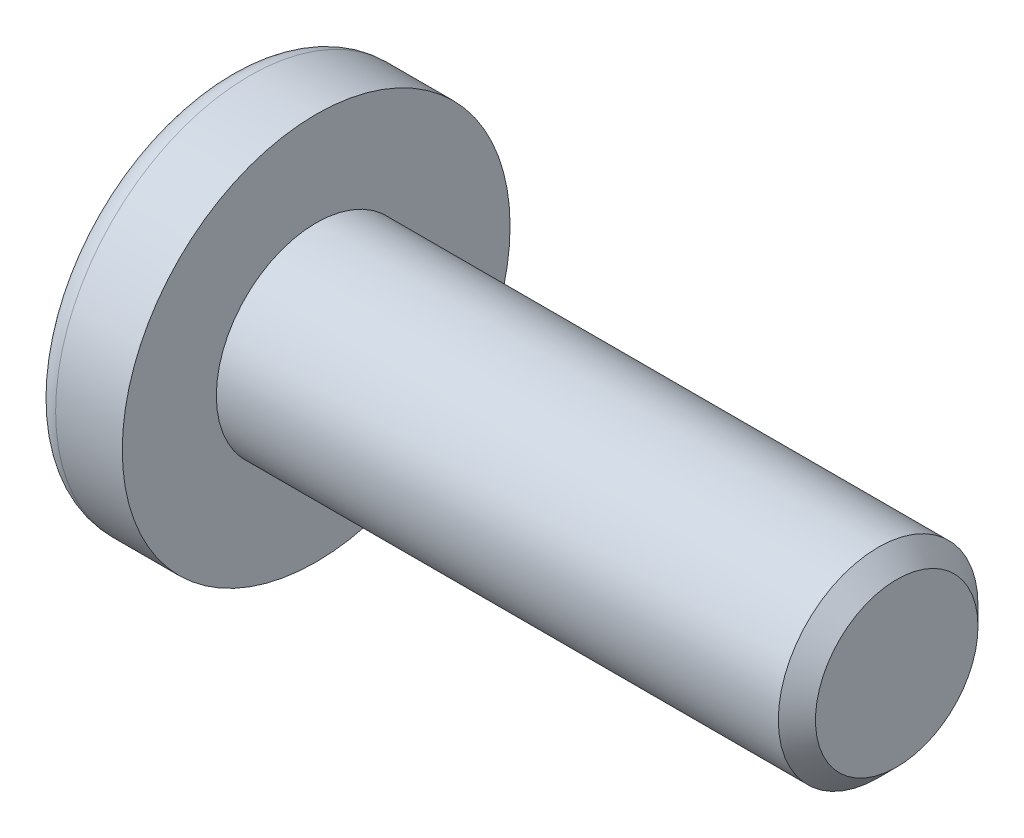
ISO-10303-21;
HEADER;
FILE_DESCRIPTION(('STEP AP214'),'2;1');
FILE_NAME('part.step','',(''),(''),'','','');
FILE_SCHEMA(('AUTOMOTIVE_DESIGN { 1 0 10303 214 1 1 1 1 }'));
ENDSEC;
DATA;
#1=APPLICATION_CONTEXT('core data for automotive mechanical design processes');
#2=APPLICATION_PROTOCOL_DEFINITION('international standard','automotive_design',2000,#1);
#3=PRODUCT_CONTEXT('',#1,'mechanical');
#4=PRODUCT('Part','Part','',(#3));
#5=PRODUCT_RELATED_PRODUCT_CATEGORY('part','',(#4));
#6=PRODUCT_DEFINITION_FORMATION('','',#4);
#7=PRODUCT_DEFINITION_CONTEXT('part definition',#1,'design');
#8=PRODUCT_DEFINITION('design','',#6,#7);
#9=PRODUCT_DEFINITION_SHAPE('','',#8);
#10=(LENGTH_UNIT() NAMED_UNIT(*) SI_UNIT(.MILLI.,.METRE.));
#11=(NAMED_UNIT(*) PLANE_ANGLE_UNIT() SI_UNIT($,.RADIAN.));
#12=(NAMED_UNIT(*) SI_UNIT($,.STERADIAN.) SOLID_ANGLE_UNIT());
#13=UNCERTAINTY_MEASURE_WITH_UNIT(LENGTH_MEASURE(1.E-05),#10,'distance_accuracy_value','');
#14=(GEOMETRIC_REPRESENTATION_CONTEXT(3) GLOBAL_UNCERTAINTY_ASSIGNED_CONTEXT((#13)) GLOBAL_UNIT_ASSIGNED_CONTEXT((#10,
#11,#12)) REPRESENTATION_CONTEXT('',''));
#15=CARTESIAN_POINT('',(0.,0.,0.));
#16=DIRECTION('',(0.,0.,1.));
#17=DIRECTION('',(1.,0.,0.));
#18=AXIS2_PLACEMENT_3D('',#15,#16,#17);
#19=CARTESIAN_POINT('',(3.49504,0.,0.));
#20=DIRECTION('',(-1.,0.,0.));
#21=DIRECTION('',(0.,1.,0.));
#22=AXIS2_PLACEMENT_3D('',#19,#20,#21);
#23=SPHERICAL_SURFACE('',#22,3.49504);
#24=CARTESIAN_POINT('',(0.638066947960321,0.,0.));
#25=DIRECTION('',(-1.,0.,0.));
#26=DIRECTION('',(0.,0.,1.));
#27=AXIS2_PLACEMENT_3D('',#24,#25,#26);
#28=CIRCLE('',#27,2.01320877742947);
#29=CARTESIAN_POINT('',(0.638066947960321,0.,2.01320877742947));
#30=VERTEX_POINT('',#29);
#31=EDGE_CURVE('E141',#30,#30,#28,.T.);
#32=ORIENTED_EDGE('',*,*,#31,.T.);
#33=EDGE_LOOP('',(#32));
#34=FACE_BOUND('',#33,.T.);
#35=CARTESIAN_POINT('',(3.48860800425343,-0.0562204072662827,0.));
#36=DIRECTION('',(-0.113665320353011,-0.99351909641891,0.));
#37=DIRECTION('',(0.99351909641891,-0.113665320353011,0.));
#38=AXIS2_PLACEMENT_3D('',#35,#36,#37);
#39=CIRCLE('',#38,3.49458187725478);
#40=CARTESIAN_POINT('',(0.227775025036725,0.316840992898337,1.19995665346604));
#41=VERTEX_POINT('',#40);
#42=CARTESIAN_POINT('',(0.033060362162214,0.339117670430593,0.339117670430593));
#43=VERTEX_POINT('',#42);
#44=EDGE_CURVE('E137',#41,#43,#39,.T.);
#45=ORIENTED_EDGE('',*,*,#44,.F.);
#46=CARTESIAN_POINT('',(2.78874832810788,0.,-0.872695468934767));
#47=DIRECTION('',(0.629103472698606,0.,0.777321568360582));
#48=DIRECTION('',(0.777321568360582,0.,-0.629103472698606));
#49=AXIS2_PLACEMENT_3D('',#46,#47,#48);
#50=CIRCLE('',#49,3.30981257691679);
#51=CARTESIAN_POINT('',(0.227775025036724,-0.316840992898345,1.19995665346604));
#52=VERTEX_POINT('',#51);
#53=EDGE_CURVE('E129',#41,#52,#50,.T.);
#54=ORIENTED_EDGE('',*,*,#53,.T.);
#55=CARTESIAN_POINT('',(3.48860800425343,0.0562204072662818,0.));
#56=DIRECTION('',(-0.11366532035301,0.99351909641891,0.));
#57=DIRECTION('',(-0.99351909641891,-0.11366532035301,0.));
#58=AXIS2_PLACEMENT_3D('',#55,#56,#57);
#59=CIRCLE('',#58,3.49458187725478);
#60=CARTESIAN_POINT('',(0.0330603621622127,-0.339117670430595,0.339117670430594));
#61=VERTEX_POINT('',#60);
#62=EDGE_CURVE('E381',#61,#52,#59,.T.);
#63=ORIENTED_EDGE('',*,*,#62,.F.);
#64=CARTESIAN_POINT('',(3.48860800425343,0.,-0.0562204072662819));
#65=DIRECTION('',(-0.11366532035301,0.,-0.99351909641891));
#66=DIRECTION('',(-0.99351909641891,0.,0.11366532035301));
#67=AXIS2_PLACEMENT_3D('',#64,#65,#66);
#68=CIRCLE('',#67,3.49458187725478);
#69=CARTESIAN_POINT('',(0.227775025036724,-1.19995665346604,0.316840992898341));
#70=VERTEX_POINT('',#69);
#71=EDGE_CURVE('E175',#70,#61,#68,.T.);
#72=ORIENTED_EDGE('',*,*,#71,.F.);
#73=CARTESIAN_POINT('',(2.78874832810788,0.872695468934764,0.));
#74=DIRECTION('',(0.629103472698606,-0.777321568360582,0.));
#75=DIRECTION('',(0.777321568360582,0.629103472698606,0.));
#76=AXIS2_PLACEMENT_3D('',#73,#74,#75);
#77=CIRCLE('',#76,3.30981257691679);
#78=CARTESIAN_POINT('',(0.227775025036722,-1.19995665346604,-0.316840992898341));
#79=VERTEX_POINT('',#78);
#80=EDGE_CURVE('E171',#70,#79,#77,.T.);
#81=ORIENTED_EDGE('',*,*,#80,.T.);
#82=CARTESIAN_POINT('',(3.48860800425343,0.,0.0562204072662826));
#83=DIRECTION('',(-0.113665320353011,0.,0.99351909641891));
#84=DIRECTION('',(0.99351909641891,0.,0.113665320353011));
#85=AXIS2_PLACEMENT_3D('',#82,#83,#84);
#86=CIRCLE('',#85,3.49458187725478);
#87=CARTESIAN_POINT('',(0.0330603621622127,-0.339117670430592,-0.339117670430594));
#88=VERTEX_POINT('',#87);
#89=EDGE_CURVE('E55',#88,#79,#86,.T.);
#90=ORIENTED_EDGE('',*,*,#89,.F.);
#91=CARTESIAN_POINT('',(0.227775025036724,-0.316840992898336,-1.19995665346604));
#92=VERTEX_POINT('',#91);
#93=EDGE_CURVE('E379',#92,#88,#59,.T.);
#94=ORIENTED_EDGE('',*,*,#93,.F.);
#95=CARTESIAN_POINT('',(2.78874832810788,0.,0.872695468934766));
#96=DIRECTION('',(0.629103472698606,0.,-0.777321568360582));
#97=DIRECTION('',(-0.777321568360582,0.,-0.629103472698606));
#98=AXIS2_PLACEMENT_3D('',#95,#96,#97);
#99=CIRCLE('',#98,3.30981257691679);
#100=CARTESIAN_POINT('',(0.227775025036724,0.316840992898345,-1.19995665346604));
#101=VERTEX_POINT('',#100);
#102=EDGE_CURVE('E386',#92,#101,#99,.T.);
#103=ORIENTED_EDGE('',*,*,#102,.T.);
#104=CARTESIAN_POINT('',(0.033060362162214,0.339117670430595,-0.339117670430594));
#105=VERTEX_POINT('',#104);
#106=EDGE_CURVE('E114',#105,#101,#39,.T.);
#107=ORIENTED_EDGE('',*,*,#106,.F.);
#108=CARTESIAN_POINT('',(0.227775025036726,1.19995665346604,-0.316840992898341));
#109=VERTEX_POINT('',#108);
#110=EDGE_CURVE('E136',#109,#105,#86,.T.);
#111=ORIENTED_EDGE('',*,*,#110,.F.);
#112=CARTESIAN_POINT('',(2.78874832810788,-0.872695468934769,0.));
#113=DIRECTION('',(0.629103472698606,0.777321568360582,0.));
#114=DIRECTION('',(-0.777321568360582,0.629103472698606,0.));
#115=AXIS2_PLACEMENT_3D('',#112,#113,#114);
#116=CIRCLE('',#115,3.30981257691679);
#117=CARTESIAN_POINT('',(0.227775025036726,1.19995665346604,0.31684099289834));
#118=VERTEX_POINT('',#117);
#119=EDGE_CURVE('E63',#109,#118,#116,.T.);
#120=ORIENTED_EDGE('',*,*,#119,.T.);
#121=EDGE_CURVE('E174',#43,#118,#68,.T.);
#122=ORIENTED_EDGE('',*,*,#121,.F.);
#123=EDGE_LOOP('',(#45,#54,#63,#72,#81,#90,#94,#103,#107,#111,#120,#122));
#124=FACE_BOUND('',#123,.T.);
#125=ADVANCED_FACE('F40',(#34,#124),#23,.T.);
#126=CARTESIAN_POINT('',(1.71044397905759,0.,-0.147213612565445));
#127=DIRECTION('',(-0.113665320353011,0.,0.99351909641891));
#128=DIRECTION('',(0.99351909641891,0.,0.113665320353011));
#129=AXIS2_PLACEMENT_3D('',#126,#127,#128);
#130=PLANE('',#129);
#131=ORIENTED_EDGE('',*,*,#110,.T.);
#132=DIRECTION('',(0.987162587649563,-0.112938092654823,0.112938092654823));
#133=VECTOR('',#132,1.);
#134=CARTESIAN_POINT('',(1.72685656853982,0.145335901056886,-0.145335901056885));
#135=LINE('',#134,#133);
#136=CARTESIAN_POINT('',(1.4986,0.171450000000001,-0.17145));
#137=VERTEX_POINT('',#136);
#138=EDGE_CURVE('E112',#105,#137,#135,.T.);
#139=ORIENTED_EDGE('',*,*,#138,.T.);
#140=DIRECTION('',(0.774265880811046,-0.626630437436058,0.0885812660249925));
#141=VECTOR('',#140,1.);
#142=CARTESIAN_POINT('',(0.,1.3843,-0.3429));
#143=LINE('',#142,#141);
#144=EDGE_CURVE('E134',#109,#137,#143,.T.);
#145=ORIENTED_EDGE('',*,*,#144,.F.);
#146=EDGE_LOOP('',(#131,#139,#145));
#147=FACE_BOUND('',#146,.T.);
#148=ADVANCED_FACE('F133',(#147),#130,.T.);
#149=DIRECTION('',(0.774265880811046,0.626630437436058,0.0885812660249925));
#150=VECTOR('',#149,1.);
#151=CARTESIAN_POINT('',(0.,-1.3843,-0.3429));
#152=LINE('',#151,#150);
#153=CARTESIAN_POINT('',(1.4986,-0.17145,-0.17145));
#154=VERTEX_POINT('',#153);
#155=EDGE_CURVE('E156',#79,#154,#152,.T.);
#156=ORIENTED_EDGE('',*,*,#155,.T.);
#157=DIRECTION('',(-0.987162587649563,-0.112938092654822,-0.112938092654823));
#158=VECTOR('',#157,1.);
#159=CARTESIAN_POINT('',(1.72685656853982,-0.145335901056885,-0.145335901056885));
#160=LINE('',#159,#158);
#161=EDGE_CURVE('E370',#154,#88,#160,.T.);
#162=ORIENTED_EDGE('',*,*,#161,.T.);
#163=ORIENTED_EDGE('',*,*,#89,.T.);
#164=EDGE_LOOP('',(#156,#162,#163));
#165=FACE_BOUND('',#164,.T.);
#166=ADVANCED_FACE('F204',(#165),#130,.T.);
#167=CARTESIAN_POINT('',(1.71044397905759,0.,0.147213612565445));
#168=DIRECTION('',(-0.11366532035301,0.,-0.99351909641891));
#169=DIRECTION('',(-0.99351909641891,0.,0.11366532035301));
#170=AXIS2_PLACEMENT_3D('',#167,#168,#169);
#171=PLANE('',#170);
#172=DIRECTION('',(0.774265880811046,-0.626630437436058,-0.0885812660249922));
#173=VECTOR('',#172,1.);
#174=CARTESIAN_POINT('',(0.,1.3843,0.342899999999999));
#175=LINE('',#174,#173);
#176=CARTESIAN_POINT('',(1.4986,0.17145,0.17145));
#177=VERTEX_POINT('',#176);
#178=EDGE_CURVE('E142',#118,#177,#175,.T.);
#179=ORIENTED_EDGE('',*,*,#178,.T.);
#180=DIRECTION('',(-0.987162587649563,0.112938092654822,0.112938092654822));
#181=VECTOR('',#180,1.);
#182=CARTESIAN_POINT('',(1.72685656853981,0.145335901056885,0.145335901056886));
#183=LINE('',#182,#181);
#184=EDGE_CURVE('E376',#177,#43,#183,.T.);
#185=ORIENTED_EDGE('',*,*,#184,.T.);
#186=ORIENTED_EDGE('',*,*,#121,.T.);
#187=EDGE_LOOP('',(#179,#185,#186));
#188=FACE_BOUND('',#187,.T.);
#189=ADVANCED_FACE('F235',(#188),#171,.T.);
#190=ORIENTED_EDGE('',*,*,#71,.T.);
#191=DIRECTION('',(0.987162587649563,0.112938092654823,-0.112938092654822));
#192=VECTOR('',#191,1.);
#193=CARTESIAN_POINT('',(1.72685656853982,-0.145335901056886,0.145335901056886));
#194=LINE('',#193,#192);
#195=CARTESIAN_POINT('',(1.4986,-0.171450000000001,0.171449999999999));
#196=VERTEX_POINT('',#195);
#197=EDGE_CURVE('E383',#61,#196,#194,.T.);
#198=ORIENTED_EDGE('',*,*,#197,.T.);
#199=DIRECTION('',(0.774265880811046,0.626630437436058,-0.0885812660249922));
#200=VECTOR('',#199,1.);
#201=CARTESIAN_POINT('',(0.,-1.3843,0.342899999999999));
#202=LINE('',#201,#200);
#203=EDGE_CURVE('E153',#70,#196,#202,.T.);
#204=ORIENTED_EDGE('',*,*,#203,.F.);
#205=EDGE_LOOP('',(#190,#198,#204));
#206=FACE_BOUND('',#205,.T.);
#207=ADVANCED_FACE('F224',(#206),#171,.T.);
#208=CARTESIAN_POINT('',(-25.4,0.,0.));
#209=DIRECTION('',(-1.,0.,0.));
#210=DIRECTION('',(0.,0.,1.));
#211=AXIS2_PLACEMENT_3D('',#208,#209,#210);
#212=CYLINDRICAL_SURFACE('',#211,1.0922);
#213=CARTESIAN_POINT('',(7.7216,0.,0.));
#214=DIRECTION('',(1.,0.,0.));
#215=DIRECTION('',(0.,0.,-1.));
#216=AXIS2_PLACEMENT_3D('',#213,#214,#215);
#217=CIRCLE('',#216,1.0922);
#218=CARTESIAN_POINT('',(7.7216,0.,-1.0922));
#219=VERTEX_POINT('',#218);
#220=EDGE_CURVE('E48',#219,#219,#217,.F.);
#221=ORIENTED_EDGE('',*,*,#220,.T.);
#222=EDGE_LOOP('',(#221));
#223=FACE_BOUND('',#222,.T.);
#224=CARTESIAN_POINT('',(1.5748,0.,0.));
#225=DIRECTION('',(-1.,0.,0.));
#226=DIRECTION('',(0.,0.,1.));
#227=AXIS2_PLACEMENT_3D('',#224,#225,#226);
#228=CIRCLE('',#227,1.0922);
#229=CARTESIAN_POINT('',(1.5748,0.,1.0922));
#230=VERTEX_POINT('',#229);
#231=EDGE_CURVE('E168',#230,#230,#228,.T.);
#232=ORIENTED_EDGE('',*,*,#231,.F.);
#233=EDGE_LOOP('',(#232));
#234=FACE_BOUND('',#233,.T.);
#235=ADVANCED_FACE('F42',(#223,#234),#212,.T.);
#236=CARTESIAN_POINT('',(1.5748,1.0922,0.));
#237=DIRECTION('',(-1.,0.,0.));
#238=DIRECTION('',(0.,0.,1.));
#239=AXIS2_PLACEMENT_3D('',#236,#237,#238);
#240=PLANE('',#239);
#241=CARTESIAN_POINT('',(1.5748,0.,0.));
#242=DIRECTION('',(-1.,0.,0.));
#243=DIRECTION('',(0.,0.,1.));
#244=AXIS2_PLACEMENT_3D('',#241,#242,#243);
#245=CIRCLE('',#244,2.1209);
#246=CARTESIAN_POINT('',(1.5748,0.,2.1209));
#247=VERTEX_POINT('',#246);
#248=EDGE_CURVE('E165',#247,#247,#245,.T.);
#249=ORIENTED_EDGE('',*,*,#248,.F.);
#250=EDGE_LOOP('',(#249));
#251=FACE_BOUND('',#250,.T.);
#252=ORIENTED_EDGE('',*,*,#231,.T.);
#253=EDGE_LOOP('',(#252));
#254=FACE_BOUND('',#253,.T.);
#255=ADVANCED_FACE('F217',(#251,#254),#240,.F.);
#256=CARTESIAN_POINT('',(-25.4,0.,0.));
#257=DIRECTION('',(-1.,0.,0.));
#258=DIRECTION('',(0.,0.,1.));
#259=AXIS2_PLACEMENT_3D('',#256,#257,#258);
#260=CYLINDRICAL_SURFACE('',#259,2.1209);
#261=ORIENTED_EDGE('',*,*,#248,.T.);
#262=EDGE_LOOP('',(#261));
#263=FACE_BOUND('',#262,.T.);
#264=CARTESIAN_POINT('',(0.845695803486458,0.,0.));
#265=DIRECTION('',(-1.,0.,0.));
#266=DIRECTION('',(0.,0.,1.));
#267=AXIS2_PLACEMENT_3D('',#264,#265,#266);
#268=CIRCLE('',#267,2.1209);
#269=CARTESIAN_POINT('',(0.845695803486458,0.,2.1209));
#270=VERTEX_POINT('',#269);
#271=EDGE_CURVE('E162',#270,#270,#268,.T.);
#272=ORIENTED_EDGE('',*,*,#271,.F.);
#273=EDGE_LOOP('',(#272));
#274=FACE_BOUND('',#273,.T.);
#275=ADVANCED_FACE('F214',(#263,#274),#260,.T.);
#276=CARTESIAN_POINT('',(0.845695803486459,0.,0.));
#277=DIRECTION('',(-1.,0.,0.));
#278=DIRECTION('',(0.,0.,1.));
#279=AXIS2_PLACEMENT_3D('',#276,#277,#278);
#280=TOROIDAL_SURFACE('',#279,1.8669,0.254000000000001);
#281=ORIENTED_EDGE('',*,*,#271,.T.);
#282=EDGE_LOOP('',(#281));
#283=FACE_BOUND('',#282,.T.);
#284=ORIENTED_EDGE('',*,*,#31,.F.);
#285=EDGE_LOOP('',(#284));
#286=FACE_BOUND('',#285,.T.);
#287=ADVANCED_FACE('F211',(#283,#286),#280,.T.);
#288=CARTESIAN_POINT('',(7.9248,1.0922,0.));
#289=DIRECTION('',(1.,0.,0.));
#290=DIRECTION('',(0.,0.,-1.));
#291=AXIS2_PLACEMENT_3D('',#288,#289,#290);
#292=PLANE('',#291);
#293=CARTESIAN_POINT('',(7.9248,0.,0.));
#294=DIRECTION('',(1.,0.,0.));
#295=DIRECTION('',(0.,0.,-1.));
#296=AXIS2_PLACEMENT_3D('',#293,#294,#295);
#297=CIRCLE('',#296,0.888999999999997);
#298=CARTESIAN_POINT('',(7.9248,0.,-0.888999999999997));
#299=VERTEX_POINT('',#298);
#300=EDGE_CURVE('E11',#299,#299,#297,.T.);
#301=ORIENTED_EDGE('',*,*,#300,.T.);
#302=EDGE_LOOP('',(#301));
#303=FACE_BOUND('',#302,.T.);
#304=ADVANCED_FACE('F209',(#303),#292,.T.);
#305=CARTESIAN_POINT('',(1.4986,0.17145,0.17145));
#306=DIRECTION('',(0.629103472698606,0.777321568360582,0.));
#307=DIRECTION('',(-0.777321568360582,0.629103472698606,0.));
#308=AXIS2_PLACEMENT_3D('',#305,#306,#307);
#309=PLANE('',#308);
#310=ORIENTED_EDGE('',*,*,#144,.T.);
#311=DIRECTION('',(0.,0.,-1.));
#312=VECTOR('',#311,1.);
#313=CARTESIAN_POINT('',(1.4986,0.17145,0.17145));
#314=LINE('',#313,#312);
#315=EDGE_CURVE('E128',#177,#137,#314,.T.);
#316=ORIENTED_EDGE('',*,*,#315,.F.);
#317=ORIENTED_EDGE('',*,*,#178,.F.);
#318=ORIENTED_EDGE('',*,*,#119,.F.);
#319=EDGE_LOOP('',(#310,#316,#317,#318));
#320=FACE_BOUND('',#319,.T.);
#321=ADVANCED_FACE('F140',(#320),#309,.F.);
#322=CARTESIAN_POINT('',(0.,-1.3843,-0.3429));
#323=DIRECTION('',(0.629103472698606,-0.777321568360582,0.));
#324=DIRECTION('',(0.777321568360582,0.629103472698606,0.));
#325=AXIS2_PLACEMENT_3D('',#322,#323,#324);
#326=PLANE('',#325);
#327=ORIENTED_EDGE('',*,*,#203,.T.);
#328=DIRECTION('',(0.,0.,1.));
#329=VECTOR('',#328,1.);
#330=CARTESIAN_POINT('',(1.4986,-0.17145,-0.17145));
#331=LINE('',#330,#329);
#332=EDGE_CURVE('E149',#154,#196,#331,.T.);
#333=ORIENTED_EDGE('',*,*,#332,.F.);
#334=ORIENTED_EDGE('',*,*,#155,.F.);
#335=ORIENTED_EDGE('',*,*,#80,.F.);
#336=EDGE_LOOP('',(#327,#333,#334,#335));
#337=FACE_BOUND('',#336,.T.);
#338=ADVANCED_FACE('F243',(#337),#326,.F.);
#339=CARTESIAN_POINT('',(1.4986,0.17145,-0.17145));
#340=DIRECTION('',(-1.,0.,0.));
#341=DIRECTION('',(0.,0.,1.));
#342=AXIS2_PLACEMENT_3D('',#339,#340,#341);
#343=PLANE('',#342);
#344=DIRECTION('',(0.,1.,0.));
#345=VECTOR('',#344,1.);
#346=CARTESIAN_POINT('',(1.4986,-0.17145,-0.17145));
#347=LINE('',#346,#345);
#348=EDGE_CURVE('E121',#154,#137,#347,.T.);
#349=ORIENTED_EDGE('',*,*,#348,.F.);
#350=ORIENTED_EDGE('',*,*,#332,.T.);
#351=DIRECTION('',(0.,-1.,0.));
#352=VECTOR('',#351,1.);
#353=CARTESIAN_POINT('',(1.4986,0.17145,0.17145));
#354=LINE('',#353,#352);
#355=EDGE_CURVE('E147',#177,#196,#354,.T.);
#356=ORIENTED_EDGE('',*,*,#355,.F.);
#357=ORIENTED_EDGE('',*,*,#315,.T.);
#358=EDGE_LOOP('',(#349,#350,#356,#357));
#359=FACE_BOUND('',#358,.T.);
#360=ADVANCED_FACE('F145',(#359),#343,.T.);
#361=CARTESIAN_POINT('',(0.,0.342900000000005,-1.3843));
#362=DIRECTION('',(0.629103472698606,0.,-0.777321568360582));
#363=DIRECTION('',(0.777321568360582,0.,0.629103472698606));
#364=AXIS2_PLACEMENT_3D('',#361,#362,#363);
#365=PLANE('',#364);
#366=DIRECTION('',(0.774265880811046,0.08858126602499,0.626630437436058));
#367=VECTOR('',#366,1.);
#368=CARTESIAN_POINT('',(0.,-0.342899999999994,-1.3843));
#369=LINE('',#368,#367);
#370=EDGE_CURVE('E118',#92,#154,#369,.T.);
#371=ORIENTED_EDGE('',*,*,#370,.T.);
#372=ORIENTED_EDGE('',*,*,#348,.T.);
#373=DIRECTION('',(0.774265880811046,-0.0885812660249947,0.626630437436057));
#374=VECTOR('',#373,1.);
#375=CARTESIAN_POINT('',(0.,0.342900000000005,-1.3843));
#376=LINE('',#375,#374);
#377=EDGE_CURVE('E108',#101,#137,#376,.T.);
#378=ORIENTED_EDGE('',*,*,#377,.F.);
#379=ORIENTED_EDGE('',*,*,#102,.F.);
#380=EDGE_LOOP('',(#371,#372,#378,#379));
#381=FACE_BOUND('',#380,.T.);
#382=ADVANCED_FACE('F122',(#381),#365,.F.);
#383=CARTESIAN_POINT('',(1.71044397905759,-0.147213612565445,0.));
#384=DIRECTION('',(-0.11366532035301,0.99351909641891,0.));
#385=DIRECTION('',(-0.99351909641891,-0.11366532035301,0.));
#386=AXIS2_PLACEMENT_3D('',#383,#384,#385);
#387=PLANE('',#386);
#388=ORIENTED_EDGE('',*,*,#93,.T.);
#389=ORIENTED_EDGE('',*,*,#161,.F.);
#390=ORIENTED_EDGE('',*,*,#370,.F.);
#391=EDGE_LOOP('',(#388,#389,#390));
#392=FACE_BOUND('',#391,.T.);
#393=ADVANCED_FACE('F195',(#392),#387,.T.);
#394=CARTESIAN_POINT('',(1.71044397905759,0.147213612565445,0.));
#395=DIRECTION('',(-0.113665320353011,-0.99351909641891,0.));
#396=DIRECTION('',(0.99351909641891,-0.113665320353011,0.));
#397=AXIS2_PLACEMENT_3D('',#394,#395,#396);
#398=PLANE('',#397);
#399=ORIENTED_EDGE('',*,*,#106,.T.);
#400=ORIENTED_EDGE('',*,*,#377,.T.);
#401=ORIENTED_EDGE('',*,*,#138,.F.);
#402=EDGE_LOOP('',(#399,#400,#401));
#403=FACE_BOUND('',#402,.T.);
#404=ADVANCED_FACE('F110',(#403),#398,.T.);
#405=CARTESIAN_POINT('',(1.4986,-0.171450000000001,0.171449999999999));
#406=DIRECTION('',(0.629103472698606,0.,0.777321568360582));
#407=DIRECTION('',(-0.777321568360582,0.,0.629103472698606));
#408=AXIS2_PLACEMENT_3D('',#405,#406,#407);
#409=PLANE('',#408);
#410=DIRECTION('',(0.774265880811046,-0.0885812660249903,-0.626630437436058));
#411=VECTOR('',#410,1.);
#412=CARTESIAN_POINT('',(0.,0.342899999999995,1.3843));
#413=LINE('',#412,#411);
#414=EDGE_CURVE('E388',#41,#177,#413,.T.);
#415=ORIENTED_EDGE('',*,*,#414,.T.);
#416=ORIENTED_EDGE('',*,*,#355,.T.);
#417=DIRECTION('',(0.774265880811046,0.0885812660249944,-0.626630437436058));
#418=VECTOR('',#417,1.);
#419=CARTESIAN_POINT('',(0.,-0.342900000000004,1.3843));
#420=LINE('',#419,#418);
#421=EDGE_CURVE('E117',#52,#196,#420,.T.);
#422=ORIENTED_EDGE('',*,*,#421,.F.);
#423=ORIENTED_EDGE('',*,*,#53,.F.);
#424=EDGE_LOOP('',(#415,#416,#422,#423));
#425=FACE_BOUND('',#424,.T.);
#426=ADVANCED_FACE('F289',(#425),#409,.F.);
#427=ORIENTED_EDGE('',*,*,#44,.T.);
#428=ORIENTED_EDGE('',*,*,#184,.F.);
#429=ORIENTED_EDGE('',*,*,#414,.F.);
#430=EDGE_LOOP('',(#427,#428,#429));
#431=FACE_BOUND('',#430,.T.);
#432=ADVANCED_FACE('F192',(#431),#398,.T.);
#433=ORIENTED_EDGE('',*,*,#62,.T.);
#434=ORIENTED_EDGE('',*,*,#421,.T.);
#435=ORIENTED_EDGE('',*,*,#197,.F.);
#436=EDGE_LOOP('',(#433,#434,#435));
#437=FACE_BOUND('',#436,.T.);
#438=ADVANCED_FACE('F186',(#437),#387,.T.);
#439=CARTESIAN_POINT('',(7.7216,0.,0.));
#440=DIRECTION('',(-1.,0.,0.));
#441=DIRECTION('',(0.,0.,1.));
#442=AXIS2_PLACEMENT_3D('',#439,#440,#441);
#443=CONICAL_SURFACE('',#442,1.0922,0.785398163397455);
#444=ORIENTED_EDGE('',*,*,#300,.F.);
#445=EDGE_LOOP('',(#444));
#446=FACE_BOUND('',#445,.T.);
#447=ORIENTED_EDGE('',*,*,#220,.F.);
#448=EDGE_LOOP('',(#447));
#449=FACE_BOUND('',#448,.T.);
#450=ADVANCED_FACE('F184',(#446,#449),#443,.T.);
#451=CLOSED_SHELL('',(#125,#148,#166,#189,#207,#235,#255,#275,#287,#304,#321,#338,#360,#382,
#393,#404,#426,#432,#438,#450));
#452=MANIFOLD_SOLID_BREP('B2',#451);
#453=ADVANCED_BREP_SHAPE_REPRESENTATION('',(#18,#452),#14);
#454=SHAPE_DEFINITION_REPRESENTATION(#9,#453);
ENDSEC;
END-ISO-10303-21;
